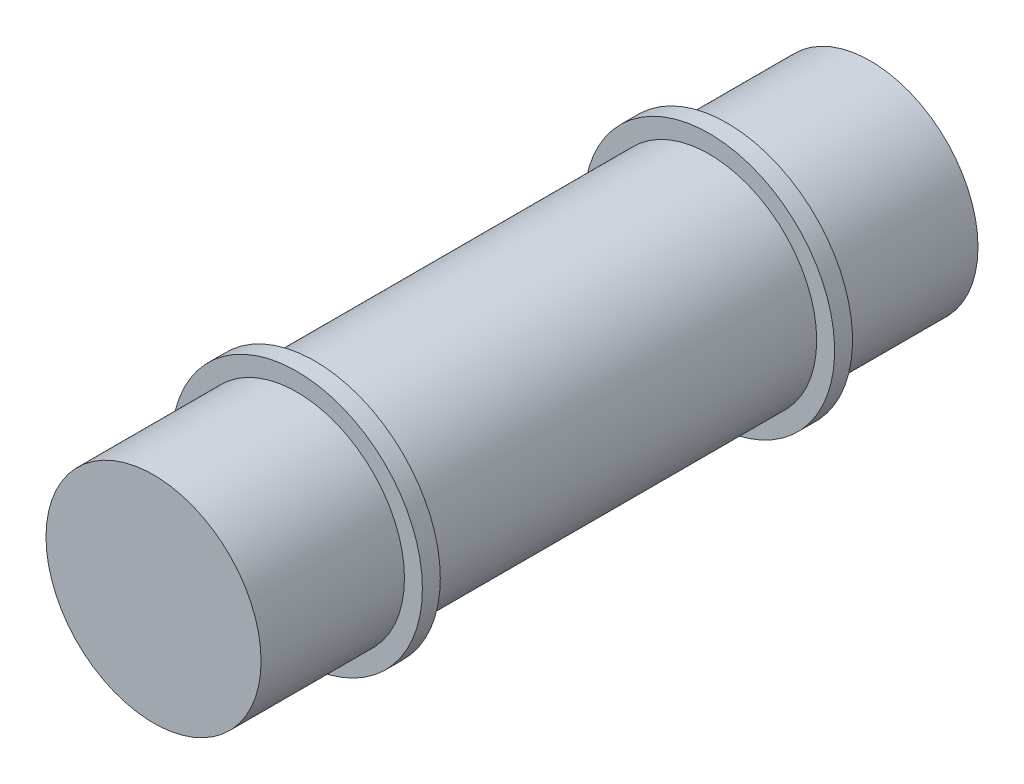
ISO-10303-21;
HEADER;
FILE_DESCRIPTION(('STEP AP214'),'2;1');
FILE_NAME('part.step','',(''),(''),'','','');
FILE_SCHEMA(('AUTOMOTIVE_DESIGN { 1 0 10303 214 1 1 1 1 }'));
ENDSEC;
DATA;
#1=APPLICATION_CONTEXT('core data for automotive mechanical design processes');
#2=APPLICATION_PROTOCOL_DEFINITION('international standard','automotive_design',2000,#1);
#3=PRODUCT_CONTEXT('',#1,'mechanical');
#4=PRODUCT('Part','Part','',(#3));
#5=PRODUCT_RELATED_PRODUCT_CATEGORY('part','',(#4));
#6=PRODUCT_DEFINITION_FORMATION('','',#4);
#7=PRODUCT_DEFINITION_CONTEXT('part definition',#1,'design');
#8=PRODUCT_DEFINITION('design','',#6,#7);
#9=PRODUCT_DEFINITION_SHAPE('','',#8);
#10=(LENGTH_UNIT() NAMED_UNIT(*) SI_UNIT(.MILLI.,.METRE.));
#11=(NAMED_UNIT(*) PLANE_ANGLE_UNIT() SI_UNIT($,.RADIAN.));
#12=(NAMED_UNIT(*) SI_UNIT($,.STERADIAN.) SOLID_ANGLE_UNIT());
#13=UNCERTAINTY_MEASURE_WITH_UNIT(LENGTH_MEASURE(1.E-05),#10,'distance_accuracy_value','');
#14=(GEOMETRIC_REPRESENTATION_CONTEXT(3) GLOBAL_UNCERTAINTY_ASSIGNED_CONTEXT((#13)) GLOBAL_UNIT_ASSIGNED_CONTEXT((#10,
#11,#12)) REPRESENTATION_CONTEXT('',''));
#15=CARTESIAN_POINT('',(0.,0.,0.));
#16=DIRECTION('',(0.,0.,1.));
#17=DIRECTION('',(1.,0.,0.));
#18=AXIS2_PLACEMENT_3D('',#15,#16,#17);
#19=CARTESIAN_POINT('',(0.,0.,40.));
#20=DIRECTION('',(0.,0.,-1.));
#21=DIRECTION('',(-1.,0.,0.));
#22=AXIS2_PLACEMENT_3D('',#19,#20,#21);
#23=CYLINDRICAL_SURFACE('',#22,6.);
#24=CARTESIAN_POINT('',(0.,0.,9.));
#25=DIRECTION('',(0.,0.,-1.));
#26=DIRECTION('',(-1.,0.,0.));
#27=AXIS2_PLACEMENT_3D('',#24,#25,#26);
#28=CIRCLE('',#27,6.);
#29=CARTESIAN_POINT('',(-6.,0.,9.));
#30=VERTEX_POINT('',#29);
#31=EDGE_CURVE('E36',#30,#30,#28,.T.);
#32=ORIENTED_EDGE('',*,*,#31,.F.);
#33=EDGE_LOOP('',(#32));
#34=FACE_BOUND('',#33,.T.);
#35=CARTESIAN_POINT('',(0.,0.,31.));
#36=DIRECTION('',(0.,0.,1.));
#37=DIRECTION('',(1.,0.,0.));
#38=AXIS2_PLACEMENT_3D('',#35,#36,#37);
#39=CIRCLE('',#38,6.);
#40=CARTESIAN_POINT('',(6.,0.,31.));
#41=VERTEX_POINT('',#40);
#42=EDGE_CURVE('E10',#41,#41,#39,.T.);
#43=ORIENTED_EDGE('',*,*,#42,.F.);
#44=EDGE_LOOP('',(#43));
#45=FACE_BOUND('',#44,.T.);
#46=ADVANCED_FACE('F29',(#34,#45),#23,.T.);
#47=CARTESIAN_POINT('',(0.,0.,9.));
#48=DIRECTION('',(0.,0.,-1.));
#49=DIRECTION('',(-1.,0.,0.));
#50=AXIS2_PLACEMENT_3D('',#47,#48,#49);
#51=CYLINDRICAL_SURFACE('',#50,7.);
#52=CARTESIAN_POINT('',(0.,0.,9.));
#53=DIRECTION('',(0.,0.,-1.));
#54=DIRECTION('',(-1.,0.,0.));
#55=AXIS2_PLACEMENT_3D('',#52,#53,#54);
#56=CIRCLE('',#55,7.);
#57=CARTESIAN_POINT('',(-7.,0.,9.));
#58=VERTEX_POINT('',#57);
#59=EDGE_CURVE('E48',#58,#58,#56,.T.);
#60=ORIENTED_EDGE('',*,*,#59,.T.);
#61=EDGE_LOOP('',(#60));
#62=FACE_BOUND('',#61,.T.);
#63=CARTESIAN_POINT('',(0.,0.,8.));
#64=DIRECTION('',(0.,0.,-1.));
#65=DIRECTION('',(-1.,0.,0.));
#66=AXIS2_PLACEMENT_3D('',#63,#64,#65);
#67=CIRCLE('',#66,7.);
#68=CARTESIAN_POINT('',(-7.,0.,8.));
#69=VERTEX_POINT('',#68);
#70=EDGE_CURVE('E50',#69,#69,#67,.T.);
#71=ORIENTED_EDGE('',*,*,#70,.F.);
#72=EDGE_LOOP('',(#71));
#73=FACE_BOUND('',#72,.T.);
#74=ADVANCED_FACE('F93',(#62,#73),#51,.T.);
#75=CARTESIAN_POINT('',(0.,0.,9.));
#76=DIRECTION('',(0.,0.,-1.));
#77=DIRECTION('',(-1.,0.,0.));
#78=AXIS2_PLACEMENT_3D('',#75,#76,#77);
#79=PLANE('',#78);
#80=ORIENTED_EDGE('',*,*,#31,.T.);
#81=EDGE_LOOP('',(#80));
#82=FACE_BOUND('',#81,.T.);
#83=ORIENTED_EDGE('',*,*,#59,.F.);
#84=EDGE_LOOP('',(#83));
#85=FACE_BOUND('',#84,.T.);
#86=ADVANCED_FACE('F98',(#82,#85),#79,.F.);
#87=CARTESIAN_POINT('',(0.,0.,8.));
#88=DIRECTION('',(0.,0.,-1.));
#89=DIRECTION('',(-1.,0.,0.));
#90=AXIS2_PLACEMENT_3D('',#87,#88,#89);
#91=PLANE('',#90);
#92=CARTESIAN_POINT('',(0.,0.,8.));
#93=DIRECTION('',(0.,0.,-1.));
#94=DIRECTION('',(-1.,0.,0.));
#95=AXIS2_PLACEMENT_3D('',#92,#93,#94);
#96=CIRCLE('',#95,6.);
#97=CARTESIAN_POINT('',(-6.,0.,8.));
#98=VERTEX_POINT('',#97);
#99=EDGE_CURVE('E53',#98,#98,#96,.T.);
#100=ORIENTED_EDGE('',*,*,#99,.F.);
#101=EDGE_LOOP('',(#100));
#102=FACE_BOUND('',#101,.T.);
#103=ORIENTED_EDGE('',*,*,#70,.T.);
#104=EDGE_LOOP('',(#103));
#105=FACE_BOUND('',#104,.T.);
#106=ADVANCED_FACE('F114',(#102,#105),#91,.T.);
#107=CARTESIAN_POINT('',(0.,0.,0.));
#108=DIRECTION('',(0.,0.,1.));
#109=DIRECTION('',(1.,0.,0.));
#110=AXIS2_PLACEMENT_3D('',#107,#108,#109);
#111=PLANE('',#110);
#112=CARTESIAN_POINT('',(0.,0.,0.));
#113=DIRECTION('',(0.,0.,1.));
#114=DIRECTION('',(1.,0.,0.));
#115=AXIS2_PLACEMENT_3D('',#112,#113,#114);
#116=CIRCLE('',#115,6.);
#117=CARTESIAN_POINT('',(6.,0.,0.));
#118=VERTEX_POINT('',#117);
#119=EDGE_CURVE('E44',#118,#118,#116,.T.);
#120=ORIENTED_EDGE('',*,*,#119,.F.);
#121=EDGE_LOOP('',(#120));
#122=FACE_BOUND('',#121,.T.);
#123=ADVANCED_FACE('F89',(#122),#111,.F.);
#124=ORIENTED_EDGE('',*,*,#99,.T.);
#125=EDGE_LOOP('',(#124));
#126=FACE_BOUND('',#125,.T.);
#127=ORIENTED_EDGE('',*,*,#119,.T.);
#128=EDGE_LOOP('',(#127));
#129=FACE_BOUND('',#128,.T.);
#130=ADVANCED_FACE('F31',(#126,#129),#23,.T.);
#131=CARTESIAN_POINT('',(0.,0.,31.));
#132=DIRECTION('',(0.,0.,1.));
#133=DIRECTION('',(1.,0.,0.));
#134=AXIS2_PLACEMENT_3D('',#131,#132,#133);
#135=CYLINDRICAL_SURFACE('',#134,7.);
#136=CARTESIAN_POINT('',(0.,0.,31.));
#137=DIRECTION('',(0.,0.,1.));
#138=DIRECTION('',(1.,0.,0.));
#139=AXIS2_PLACEMENT_3D('',#136,#137,#138);
#140=CIRCLE('',#139,7.);
#141=CARTESIAN_POINT('',(7.,0.,31.));
#142=VERTEX_POINT('',#141);
#143=EDGE_CURVE('E58',#142,#142,#140,.T.);
#144=ORIENTED_EDGE('',*,*,#143,.T.);
#145=EDGE_LOOP('',(#144));
#146=FACE_BOUND('',#145,.T.);
#147=CARTESIAN_POINT('',(0.,0.,32.));
#148=DIRECTION('',(0.,0.,1.));
#149=DIRECTION('',(1.,0.,0.));
#150=AXIS2_PLACEMENT_3D('',#147,#148,#149);
#151=CIRCLE('',#150,7.);
#152=CARTESIAN_POINT('',(7.,0.,32.));
#153=VERTEX_POINT('',#152);
#154=EDGE_CURVE('E59',#153,#153,#151,.T.);
#155=ORIENTED_EDGE('',*,*,#154,.F.);
#156=EDGE_LOOP('',(#155));
#157=FACE_BOUND('',#156,.T.);
#158=ADVANCED_FACE('F79',(#146,#157),#135,.T.);
#159=CARTESIAN_POINT('',(0.,0.,31.));
#160=DIRECTION('',(0.,0.,1.));
#161=DIRECTION('',(1.,0.,0.));
#162=AXIS2_PLACEMENT_3D('',#159,#160,#161);
#163=PLANE('',#162);
#164=ORIENTED_EDGE('',*,*,#42,.T.);
#165=EDGE_LOOP('',(#164));
#166=FACE_BOUND('',#165,.T.);
#167=ORIENTED_EDGE('',*,*,#143,.F.);
#168=EDGE_LOOP('',(#167));
#169=FACE_BOUND('',#168,.T.);
#170=ADVANCED_FACE('F75',(#166,#169),#163,.F.);
#171=CARTESIAN_POINT('',(0.,0.,32.));
#172=DIRECTION('',(0.,0.,1.));
#173=DIRECTION('',(1.,0.,0.));
#174=AXIS2_PLACEMENT_3D('',#171,#172,#173);
#175=PLANE('',#174);
#176=CARTESIAN_POINT('',(0.,0.,32.));
#177=DIRECTION('',(0.,0.,1.));
#178=DIRECTION('',(1.,0.,0.));
#179=AXIS2_PLACEMENT_3D('',#176,#177,#178);
#180=CIRCLE('',#179,6.);
#181=CARTESIAN_POINT('',(6.,0.,32.));
#182=VERTEX_POINT('',#181);
#183=EDGE_CURVE('E62',#182,#182,#180,.T.);
#184=ORIENTED_EDGE('',*,*,#183,.F.);
#185=EDGE_LOOP('',(#184));
#186=FACE_BOUND('',#185,.T.);
#187=ORIENTED_EDGE('',*,*,#154,.T.);
#188=EDGE_LOOP('',(#187));
#189=FACE_BOUND('',#188,.T.);
#190=ADVANCED_FACE('F71',(#186,#189),#175,.T.);
#191=CARTESIAN_POINT('',(0.,0.,40.));
#192=DIRECTION('',(0.,0.,1.));
#193=DIRECTION('',(1.,0.,0.));
#194=AXIS2_PLACEMENT_3D('',#191,#192,#193);
#195=PLANE('',#194);
#196=CARTESIAN_POINT('',(0.,0.,40.));
#197=DIRECTION('',(0.,0.,1.));
#198=DIRECTION('',(1.,0.,0.));
#199=AXIS2_PLACEMENT_3D('',#196,#197,#198);
#200=CIRCLE('',#199,6.);
#201=CARTESIAN_POINT('',(6.,0.,40.));
#202=VERTEX_POINT('',#201);
#203=EDGE_CURVE('E40',#202,#202,#200,.T.);
#204=ORIENTED_EDGE('',*,*,#203,.T.);
#205=EDGE_LOOP('',(#204));
#206=FACE_BOUND('',#205,.T.);
#207=ADVANCED_FACE('F74',(#206),#195,.T.);
#208=ORIENTED_EDGE('',*,*,#183,.T.);
#209=EDGE_LOOP('',(#208));
#210=FACE_BOUND('',#209,.T.);
#211=ORIENTED_EDGE('',*,*,#203,.F.);
#212=EDGE_LOOP('',(#211));
#213=FACE_BOUND('',#212,.T.);
#214=ADVANCED_FACE('F68',(#210,#213),#23,.T.);
#215=CLOSED_SHELL('',(#46,#74,#86,#106,#123,#130,#158,#170,#190,#207,#214));
#216=MANIFOLD_SOLID_BREP('B2',#215);
#217=ADVANCED_BREP_SHAPE_REPRESENTATION('',(#18,#216),#14);
#218=SHAPE_DEFINITION_REPRESENTATION(#9,#217);
ENDSEC;
END-ISO-10303-21;
